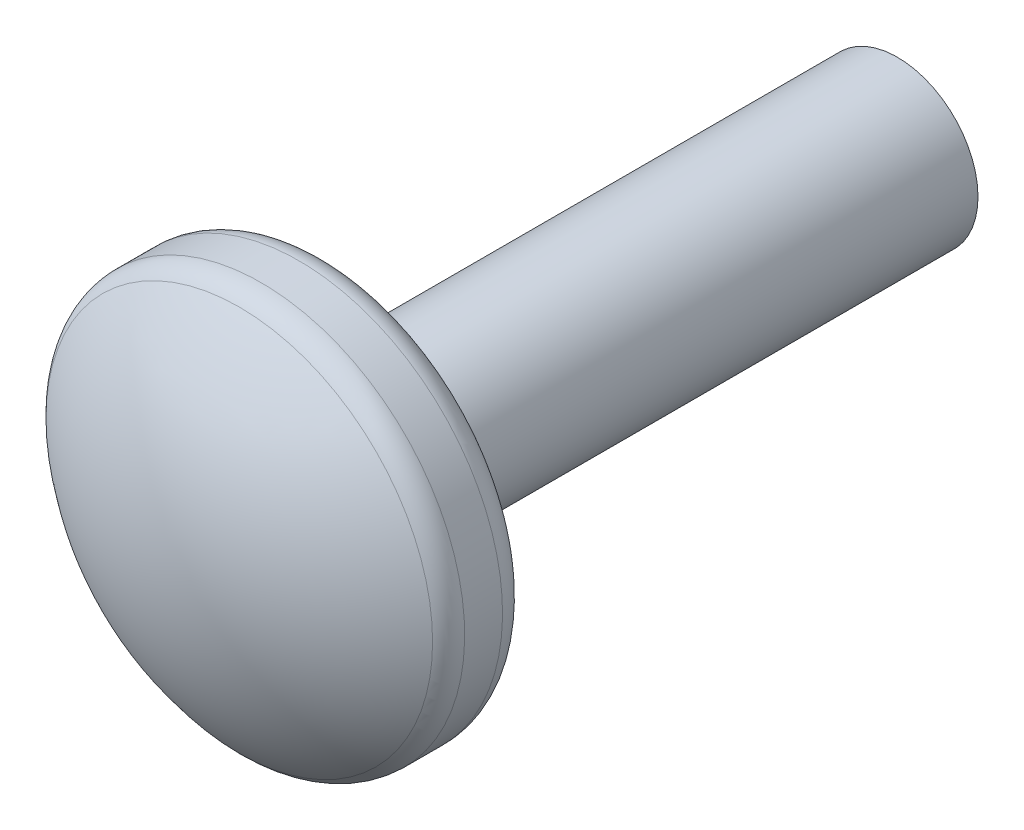
ISO-10303-21;
HEADER;
FILE_DESCRIPTION(('STEP AP214'),'2;1');
FILE_NAME('part.step','',(''),(''),'','','');
FILE_SCHEMA(('AUTOMOTIVE_DESIGN { 1 0 10303 214 1 1 1 1 }'));
ENDSEC;
DATA;
#1=APPLICATION_CONTEXT('core data for automotive mechanical design processes');
#2=APPLICATION_PROTOCOL_DEFINITION('international standard','automotive_design',2000,#1);
#3=PRODUCT_CONTEXT('',#1,'mechanical');
#4=PRODUCT('Part','Part','',(#3));
#5=PRODUCT_RELATED_PRODUCT_CATEGORY('part','',(#4));
#6=PRODUCT_DEFINITION_FORMATION('','',#4);
#7=PRODUCT_DEFINITION_CONTEXT('part definition',#1,'design');
#8=PRODUCT_DEFINITION('design','',#6,#7);
#9=PRODUCT_DEFINITION_SHAPE('','',#8);
#10=(LENGTH_UNIT() NAMED_UNIT(*) SI_UNIT(.MILLI.,.METRE.));
#11=(NAMED_UNIT(*) PLANE_ANGLE_UNIT() SI_UNIT($,.RADIAN.));
#12=(NAMED_UNIT(*) SI_UNIT($,.STERADIAN.) SOLID_ANGLE_UNIT());
#13=UNCERTAINTY_MEASURE_WITH_UNIT(LENGTH_MEASURE(1.E-05),#10,'distance_accuracy_value','');
#14=(GEOMETRIC_REPRESENTATION_CONTEXT(3) GLOBAL_UNCERTAINTY_ASSIGNED_CONTEXT((#13)) GLOBAL_UNIT_ASSIGNED_CONTEXT((#10,
#11,#12)) REPRESENTATION_CONTEXT('',''));
#15=CARTESIAN_POINT('',(0.,0.,0.));
#16=DIRECTION('',(0.,0.,1.));
#17=DIRECTION('',(1.,0.,0.));
#18=AXIS2_PLACEMENT_3D('',#15,#16,#17);
#19=CARTESIAN_POINT('',(0.,0.,14.));
#20=DIRECTION('',(0.,0.,-1.));
#21=DIRECTION('',(-1.,0.,0.));
#22=AXIS2_PLACEMENT_3D('',#19,#20,#21);
#23=PLANE('',#22);
#24=CARTESIAN_POINT('',(0.,0.,14.));
#25=DIRECTION('',(0.,0.,1.));
#26=DIRECTION('',(1.,0.,0.));
#27=AXIS2_PLACEMENT_3D('',#24,#25,#26);
#28=CIRCLE('',#27,1.98038475772934);
#29=CARTESIAN_POINT('',(1.98038475772934,0.,14.));
#30=VERTEX_POINT('',#29);
#31=EDGE_CURVE('E44',#30,#30,#28,.T.);
#32=ORIENTED_EDGE('',*,*,#31,.T.);
#33=EDGE_LOOP('',(#32));
#34=FACE_BOUND('',#33,.T.);
#35=CARTESIAN_POINT('',(0.,0.,14.));
#36=DIRECTION('',(0.,0.,1.));
#37=DIRECTION('',(0.,-1.,0.));
#38=AXIS2_PLACEMENT_3D('',#35,#36,#37);
#39=CIRCLE('',#38,4.298);
#40=CARTESIAN_POINT('',(0.,-4.298,14.));
#41=VERTEX_POINT('',#40);
#42=EDGE_CURVE('E66',#41,#41,#39,.T.);
#43=ORIENTED_EDGE('',*,*,#42,.F.);
#44=EDGE_LOOP('',(#43));
#45=FACE_BOUND('',#44,.T.);
#46=ADVANCED_FACE('F37',(#34,#45),#23,.T.);
#47=CARTESIAN_POINT('',(0.,0.,0.));
#48=DIRECTION('',(0.,0.,1.));
#49=DIRECTION('',(1.,0.,0.));
#50=AXIS2_PLACEMENT_3D('',#47,#48,#49);
#51=PLANE('',#50);
#52=CARTESIAN_POINT('',(0.,0.,0.));
#53=DIRECTION('',(0.,0.,1.));
#54=DIRECTION('',(1.,0.,0.));
#55=AXIS2_PLACEMENT_3D('',#52,#53,#54);
#56=CIRCLE('',#55,1.98038475772934);
#57=CARTESIAN_POINT('',(1.98038475772934,0.,0.));
#58=VERTEX_POINT('',#57);
#59=EDGE_CURVE('E11',#58,#58,#56,.T.);
#60=ORIENTED_EDGE('',*,*,#59,.F.);
#61=EDGE_LOOP('',(#60));
#62=FACE_BOUND('',#61,.T.);
#63=ADVANCED_FACE('F39',(#62),#51,.F.);
#64=CARTESIAN_POINT('',(0.,0.,0.));
#65=DIRECTION('',(0.,0.,1.));
#66=DIRECTION('',(1.,0.,0.));
#67=AXIS2_PLACEMENT_3D('',#64,#65,#66);
#68=CYLINDRICAL_SURFACE('',#67,1.98038475772934);
#69=ORIENTED_EDGE('',*,*,#31,.F.);
#70=EDGE_LOOP('',(#69));
#71=FACE_BOUND('',#70,.T.);
#72=ORIENTED_EDGE('',*,*,#59,.T.);
#73=EDGE_LOOP('',(#72));
#74=FACE_BOUND('',#73,.T.);
#75=ADVANCED_FACE('F79',(#71,#74),#68,.T.);
#76=CARTESIAN_POINT('',(0.,0.,14.702));
#77=DIRECTION('',(0.,0.,1.));
#78=DIRECTION('',(0.,-1.,0.));
#79=AXIS2_PLACEMENT_3D('',#76,#77,#78);
#80=TOROIDAL_SURFACE('',#79,4.298,0.702);
#81=ORIENTED_EDGE('',*,*,#42,.T.);
#82=EDGE_LOOP('',(#81));
#83=FACE_BOUND('',#82,.T.);
#84=CARTESIAN_POINT('',(0.,0.,14.702));
#85=DIRECTION('',(0.,0.,1.));
#86=DIRECTION('',(0.,-1.,0.));
#87=AXIS2_PLACEMENT_3D('',#84,#85,#86);
#88=CIRCLE('',#87,5.);
#89=CARTESIAN_POINT('',(0.,-5.00000000000001,14.702));
#90=VERTEX_POINT('',#89);
#91=EDGE_CURVE('E61',#90,#90,#88,.T.);
#92=ORIENTED_EDGE('',*,*,#91,.F.);
#93=EDGE_LOOP('',(#92));
#94=FACE_BOUND('',#93,.T.);
#95=ADVANCED_FACE('F70',(#83,#94),#80,.T.);
#96=CARTESIAN_POINT('',(0.,0.,0.));
#97=DIRECTION('',(0.,0.,-1.));
#98=DIRECTION('',(-1.,0.,0.));
#99=AXIS2_PLACEMENT_3D('',#96,#97,#98);
#100=CYLINDRICAL_SURFACE('',#99,4.99999999999999);
#101=ORIENTED_EDGE('',*,*,#91,.T.);
#102=EDGE_LOOP('',(#101));
#103=FACE_BOUND('',#102,.T.);
#104=CARTESIAN_POINT('',(0.,0.,15.6326642852247));
#105=DIRECTION('',(0.,0.,1.));
#106=DIRECTION('',(0.,-1.,0.));
#107=AXIS2_PLACEMENT_3D('',#104,#105,#106);
#108=CIRCLE('',#107,5.);
#109=CARTESIAN_POINT('',(0.,-5.00000000000001,15.6326642852246));
#110=VERTEX_POINT('',#109);
#111=EDGE_CURVE('E57',#110,#110,#108,.T.);
#112=ORIENTED_EDGE('',*,*,#111,.F.);
#113=EDGE_LOOP('',(#112));
#114=FACE_BOUND('',#113,.T.);
#115=ADVANCED_FACE('F51',(#103,#114),#100,.T.);
#116=CARTESIAN_POINT('',(0.,0.,10.5147435897436));
#117=DIRECTION('',(0.,0.,1.));
#118=DIRECTION('',(0.,1.,0.));
#119=AXIS2_PLACEMENT_3D('',#116,#117,#118);
#120=SPHERICAL_SURFACE('',#119,7.38525641025641);
#121=CARTESIAN_POINT('',(0.,0.,17.9));
#122=VERTEX_POINT('',#121);
#123=VERTEX_LOOP('',#122);
#124=FACE_BOUND('',#123,.T.);
#125=CARTESIAN_POINT('',(0.,0.,16.1702435890374));
#126=DIRECTION('',(0.,0.,1.));
#127=DIRECTION('',(0.,-1.,0.));
#128=AXIS2_PLACEMENT_3D('',#125,#126,#127);
#129=CIRCLE('',#128,4.74945596918438);
#130=CARTESIAN_POINT('',(0.,-4.74945596918438,16.1702435890374));
#131=VERTEX_POINT('',#130);
#132=EDGE_CURVE('E55',#131,#131,#129,.T.);
#133=ORIENTED_EDGE('',*,*,#132,.T.);
#134=EDGE_LOOP('',(#133));
#135=FACE_BOUND('',#134,.T.);
#136=ADVANCED_FACE('F47',(#124,#135),#120,.T.);
#137=CARTESIAN_POINT('',(0.,0.,15.6326642852247));
#138=DIRECTION('',(0.,0.,1.));
#139=DIRECTION('',(0.,-1.,0.));
#140=AXIS2_PLACEMENT_3D('',#137,#138,#139);
#141=TOROIDAL_SURFACE('',#140,4.298,0.702000000000002);
#142=ORIENTED_EDGE('',*,*,#111,.T.);
#143=EDGE_LOOP('',(#142));
#144=FACE_BOUND('',#143,.T.);
#145=ORIENTED_EDGE('',*,*,#132,.F.);
#146=EDGE_LOOP('',(#145));
#147=FACE_BOUND('',#146,.T.);
#148=ADVANCED_FACE('F50',(#144,#147),#141,.T.);
#149=CLOSED_SHELL('',(#46,#63,#75,#95,#115,#136,#148));
#150=MANIFOLD_SOLID_BREP('B2',#149);
#151=ADVANCED_BREP_SHAPE_REPRESENTATION('',(#18,#150),#14);
#152=SHAPE_DEFINITION_REPRESENTATION(#9,#151);
ENDSEC;
END-ISO-10303-21;
